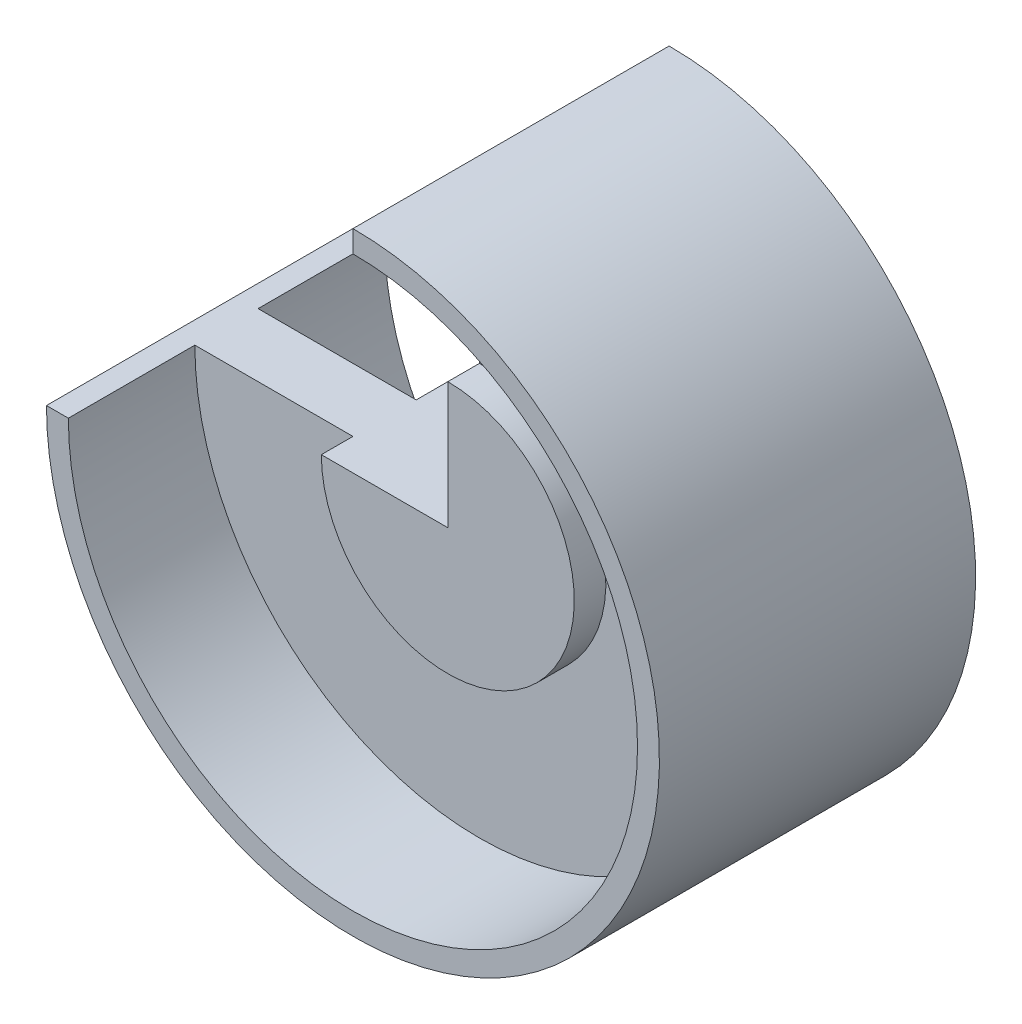
ISO-10303-21;
HEADER;
FILE_DESCRIPTION(('STEP AP214'),'2;1');
FILE_NAME('part.step','',(''),(''),'','','');
FILE_SCHEMA(('AUTOMOTIVE_DESIGN { 1 0 10303 214 1 1 1 1 }'));
ENDSEC;
DATA;
#1=APPLICATION_CONTEXT('core data for automotive mechanical design processes');
#2=APPLICATION_PROTOCOL_DEFINITION('international standard','automotive_design',2000,#1);
#3=PRODUCT_CONTEXT('',#1,'mechanical');
#4=PRODUCT('Part','Part','',(#3));
#5=PRODUCT_RELATED_PRODUCT_CATEGORY('part','',(#4));
#6=PRODUCT_DEFINITION_FORMATION('','',#4);
#7=PRODUCT_DEFINITION_CONTEXT('part definition',#1,'design');
#8=PRODUCT_DEFINITION('design','',#6,#7);
#9=PRODUCT_DEFINITION_SHAPE('','',#8);
#10=(LENGTH_UNIT() NAMED_UNIT(*) SI_UNIT(.MILLI.,.METRE.));
#11=(NAMED_UNIT(*) PLANE_ANGLE_UNIT() SI_UNIT($,.RADIAN.));
#12=(NAMED_UNIT(*) SI_UNIT($,.STERADIAN.) SOLID_ANGLE_UNIT());
#13=UNCERTAINTY_MEASURE_WITH_UNIT(LENGTH_MEASURE(1.E-05),#10,'distance_accuracy_value','');
#14=(GEOMETRIC_REPRESENTATION_CONTEXT(3) GLOBAL_UNCERTAINTY_ASSIGNED_CONTEXT((#13)) GLOBAL_UNIT_ASSIGNED_CONTEXT((#10,
#11,#12)) REPRESENTATION_CONTEXT('',''));
#15=CARTESIAN_POINT('',(0.,0.,0.));
#16=DIRECTION('',(0.,0.,1.));
#17=DIRECTION('',(1.,0.,0.));
#18=AXIS2_PLACEMENT_3D('',#15,#16,#17);
#19=CARTESIAN_POINT('',(0.,1.84127628904227,-40000.));
#20=DIRECTION('',(0.,0.,1.));
#21=DIRECTION('',(0.,-1.,0.));
#22=AXIS2_PLACEMENT_3D('',#19,#20,#21);
#23=PLANE('',#22);
#24=CARTESIAN_POINT('',(0.,1.84127628904227,-40000.));
#25=DIRECTION('',(0.,0.,1.));
#26=DIRECTION('',(0.,-1.,0.));
#27=AXIS2_PLACEMENT_3D('',#24,#25,#26);
#28=CIRCLE('',#27,20000.);
#29=CARTESIAN_POINT('',(-20000.,1.84127628925176,-40000.));
#30=VERTEX_POINT('',#29);
#31=CARTESIAN_POINT('',(0.,20001.841276289,-40000.));
#32=VERTEX_POINT('',#31);
#33=EDGE_CURVE('E11',#30,#32,#28,.T.);
#34=ORIENTED_EDGE('',*,*,#33,.F.);
#35=DIRECTION('',(-1.,0.,0.));
#36=VECTOR('',#35,1.);
#37=CARTESIAN_POINT('',(0.,1.84127628904227,-40000.));
#38=LINE('',#37,#36);
#39=CARTESIAN_POINT('',(0.,1.84127628904227,-40000.));
#40=VERTEX_POINT('',#39);
#41=EDGE_CURVE('E126',#40,#30,#38,.T.);
#42=ORIENTED_EDGE('',*,*,#41,.F.);
#43=DIRECTION('',(0.,1.,0.));
#44=VECTOR('',#43,1.);
#45=CARTESIAN_POINT('',(0.,1.84127628904227,-40000.));
#46=LINE('',#45,#44);
#47=EDGE_CURVE('E52',#40,#32,#46,.T.);
#48=ORIENTED_EDGE('',*,*,#47,.T.);
#49=EDGE_LOOP('',(#34,#42,#48));
#50=FACE_BOUND('',#49,.T.);
#51=ADVANCED_FACE('F37',(#50),#23,.F.);
#52=CARTESIAN_POINT('',(0.,1.84127628903982,-20000.));
#53=DIRECTION('',(0.,0.,1.));
#54=DIRECTION('',(0.,-1.,0.));
#55=AXIS2_PLACEMENT_3D('',#52,#53,#54);
#56=CYLINDRICAL_SURFACE('',#55,20000.);
#57=CARTESIAN_POINT('',(0.,1.84127628904166,-35000.));
#58=DIRECTION('',(0.,0.,1.));
#59=DIRECTION('',(0.,-1.,0.));
#60=AXIS2_PLACEMENT_3D('',#57,#58,#59);
#61=CIRCLE('',#60,20000.);
#62=CARTESIAN_POINT('',(-20000.,1.84127628925115,-35000.));
#63=VERTEX_POINT('',#62);
#64=CARTESIAN_POINT('',(0.,20001.841276289,-35000.));
#65=VERTEX_POINT('',#64);
#66=EDGE_CURVE('E45',#63,#65,#61,.T.);
#67=ORIENTED_EDGE('',*,*,#66,.F.);
#68=DIRECTION('',(0.,0.,1.));
#69=VECTOR('',#68,1.);
#70=CARTESIAN_POINT('',(-20000.,1.84127628925176,-40000.));
#71=LINE('',#70,#69);
#72=EDGE_CURVE('E123',#30,#63,#71,.T.);
#73=ORIENTED_EDGE('',*,*,#72,.F.);
#74=ORIENTED_EDGE('',*,*,#33,.T.);
#75=DIRECTION('',(0.,0.,1.));
#76=VECTOR('',#75,1.);
#77=CARTESIAN_POINT('',(0.,20001.841276289,-40000.));
#78=LINE('',#77,#76);
#79=EDGE_CURVE('E120',#32,#65,#78,.T.);
#80=ORIENTED_EDGE('',*,*,#79,.T.);
#81=EDGE_LOOP('',(#67,#73,#74,#80));
#82=FACE_BOUND('',#81,.T.);
#83=ADVANCED_FACE('F39',(#82),#56,.T.);
#84=CARTESIAN_POINT('',(-20000.,1.84127628925115,-35000.));
#85=DIRECTION('',(0.,0.,1.));
#86=DIRECTION('',(0.,-1.,0.));
#87=AXIS2_PLACEMENT_3D('',#84,#85,#86);
#88=PLANE('',#87);
#89=CARTESIAN_POINT('',(0.,1.84127628904166,-35000.));
#90=DIRECTION('',(0.,0.,1.));
#91=DIRECTION('',(0.,-1.,0.));
#92=AXIS2_PLACEMENT_3D('',#89,#90,#91);
#93=CIRCLE('',#92,45000.);
#94=CARTESIAN_POINT('',(-45000.,1.84127628951301,-35000.));
#95=VERTEX_POINT('',#94);
#96=CARTESIAN_POINT('',(0.,45001.841276289,-35000.));
#97=VERTEX_POINT('',#96);
#98=EDGE_CURVE('E202',#95,#97,#93,.T.);
#99=ORIENTED_EDGE('',*,*,#98,.F.);
#100=DIRECTION('',(-1.,0.,0.));
#101=VECTOR('',#100,1.);
#102=CARTESIAN_POINT('',(-20000.,1.84127628925115,-35000.));
#103=LINE('',#102,#101);
#104=EDGE_CURVE('E160',#63,#95,#103,.T.);
#105=ORIENTED_EDGE('',*,*,#104,.F.);
#106=ORIENTED_EDGE('',*,*,#66,.T.);
#107=DIRECTION('',(0.,1.,0.));
#108=VECTOR('',#107,1.);
#109=CARTESIAN_POINT('',(0.,20001.841276289,-35000.));
#110=LINE('',#109,#108);
#111=EDGE_CURVE('E131',#65,#97,#110,.T.);
#112=ORIENTED_EDGE('',*,*,#111,.T.);
#113=EDGE_LOOP('',(#99,#105,#106,#112));
#114=FACE_BOUND('',#113,.T.);
#115=ADVANCED_FACE('F205',(#114),#88,.F.);
#116=CARTESIAN_POINT('',(0.,1.84127628903982,-20000.));
#117=DIRECTION('',(0.,0.,1.));
#118=DIRECTION('',(0.,-1.,0.));
#119=AXIS2_PLACEMENT_3D('',#116,#117,#118);
#120=CYLINDRICAL_SURFACE('',#119,45000.);
#121=CARTESIAN_POINT('',(0.,1.84127628904411,-55000.));
#122=DIRECTION('',(0.,0.,1.));
#123=DIRECTION('',(0.,-1.,0.));
#124=AXIS2_PLACEMENT_3D('',#121,#122,#123);
#125=CIRCLE('',#124,45000.);
#126=CARTESIAN_POINT('',(-45000.,1.84127628951546,-55000.));
#127=VERTEX_POINT('',#126);
#128=CARTESIAN_POINT('',(0.,45001.8412762891,-55000.));
#129=VERTEX_POINT('',#128);
#130=EDGE_CURVE('E200',#127,#129,#125,.T.);
#131=ORIENTED_EDGE('',*,*,#130,.F.);
#132=DIRECTION('',(0.,0.,-1.));
#133=VECTOR('',#132,1.);
#134=CARTESIAN_POINT('',(-45000.,1.84127628951301,-35000.));
#135=LINE('',#134,#133);
#136=EDGE_CURVE('E163',#95,#127,#135,.T.);
#137=ORIENTED_EDGE('',*,*,#136,.F.);
#138=ORIENTED_EDGE('',*,*,#98,.T.);
#139=DIRECTION('',(0.,0.,-1.));
#140=VECTOR('',#139,1.);
#141=CARTESIAN_POINT('',(0.,45001.841276289,-35000.));
#142=LINE('',#141,#140);
#143=EDGE_CURVE('E133',#97,#129,#142,.T.);
#144=ORIENTED_EDGE('',*,*,#143,.T.);
#145=EDGE_LOOP('',(#131,#137,#138,#144));
#146=FACE_BOUND('',#145,.T.);
#147=ADVANCED_FACE('F237',(#146),#120,.F.);
#148=CARTESIAN_POINT('',(-45000.,1.84127628951546,-55000.));
#149=DIRECTION('',(0.,0.,1.));
#150=DIRECTION('',(0.,-1.,0.));
#151=AXIS2_PLACEMENT_3D('',#148,#149,#150);
#152=PLANE('',#151);
#153=CARTESIAN_POINT('',(0.,1.84127628904411,-55000.));
#154=DIRECTION('',(0.,0.,1.));
#155=DIRECTION('',(0.,-1.,0.));
#156=AXIS2_PLACEMENT_3D('',#153,#154,#155);
#157=CIRCLE('',#156,48463.8192766661);
#158=CARTESIAN_POINT('',(-48463.8192766661,1.84127628955174,-55000.));
#159=VERTEX_POINT('',#158);
#160=CARTESIAN_POINT('',(0.,48465.6605529551,-55000.));
#161=VERTEX_POINT('',#160);
#162=EDGE_CURVE('E198',#159,#161,#157,.T.);
#163=ORIENTED_EDGE('',*,*,#162,.F.);
#164=DIRECTION('',(-1.,0.,0.));
#165=VECTOR('',#164,1.);
#166=CARTESIAN_POINT('',(-45000.,1.84127628951546,-55000.));
#167=LINE('',#166,#165);
#168=EDGE_CURVE('E166',#127,#159,#167,.T.);
#169=ORIENTED_EDGE('',*,*,#168,.F.);
#170=ORIENTED_EDGE('',*,*,#130,.T.);
#171=DIRECTION('',(0.,1.,0.));
#172=VECTOR('',#171,1.);
#173=CARTESIAN_POINT('',(0.,45001.8412762891,-55000.));
#174=LINE('',#173,#172);
#175=EDGE_CURVE('E138',#129,#161,#174,.T.);
#176=ORIENTED_EDGE('',*,*,#175,.T.);
#177=EDGE_LOOP('',(#163,#169,#170,#176));
#178=FACE_BOUND('',#177,.T.);
#179=ADVANCED_FACE('F235',(#178),#152,.F.);
#180=CARTESIAN_POINT('',(0.,1.84127628903982,-20000.));
#181=DIRECTION('',(0.,0.,1.));
#182=DIRECTION('',(0.,-1.,0.));
#183=AXIS2_PLACEMENT_3D('',#180,#181,#182);
#184=CYLINDRICAL_SURFACE('',#183,48463.8192766661);
#185=CARTESIAN_POINT('',(0.,1.84127628903798,-5000.00000000001));
#186=DIRECTION('',(0.,0.,1.));
#187=DIRECTION('',(0.,-1.,0.));
#188=AXIS2_PLACEMENT_3D('',#185,#186,#187);
#189=CIRCLE('',#188,48463.8192766661);
#190=CARTESIAN_POINT('',(-48463.8192766661,1.84127628954562,-5000.00000000001));
#191=VERTEX_POINT('',#190);
#192=CARTESIAN_POINT('',(0.,48465.6605529551,-5000.));
#193=VERTEX_POINT('',#192);
#194=EDGE_CURVE('E196',#191,#193,#189,.T.);
#195=ORIENTED_EDGE('',*,*,#194,.F.);
#196=DIRECTION('',(0.,0.,1.));
#197=VECTOR('',#196,1.);
#198=CARTESIAN_POINT('',(-48463.8192766661,1.84127628955174,-55000.));
#199=LINE('',#198,#197);
#200=EDGE_CURVE('E169',#159,#191,#199,.T.);
#201=ORIENTED_EDGE('',*,*,#200,.F.);
#202=ORIENTED_EDGE('',*,*,#162,.T.);
#203=DIRECTION('',(0.,0.,1.));
#204=VECTOR('',#203,1.);
#205=CARTESIAN_POINT('',(0.,48465.6605529551,-55000.));
#206=LINE('',#205,#204);
#207=EDGE_CURVE('E141',#161,#193,#206,.T.);
#208=ORIENTED_EDGE('',*,*,#207,.T.);
#209=EDGE_LOOP('',(#195,#201,#202,#208));
#210=FACE_BOUND('',#209,.T.);
#211=ADVANCED_FACE('F232',(#210),#184,.T.);
#212=CARTESIAN_POINT('',(-45000.,1.84127628950933,-5000.00000000001));
#213=DIRECTION('',(0.,0.,-1.));
#214=DIRECTION('',(0.,1.,0.));
#215=AXIS2_PLACEMENT_3D('',#212,#213,#214);
#216=PLANE('',#215);
#217=CARTESIAN_POINT('',(0.,1.84127628903798,-5000.00000000001));
#218=DIRECTION('',(0.,0.,1.));
#219=DIRECTION('',(0.,-1.,0.));
#220=AXIS2_PLACEMENT_3D('',#217,#218,#219);
#221=CIRCLE('',#220,45000.);
#222=CARTESIAN_POINT('',(-45000.,1.84127628950933,-5000.00000000001));
#223=VERTEX_POINT('',#222);
#224=CARTESIAN_POINT('',(0.,45001.841276289,-5000.));
#225=VERTEX_POINT('',#224);
#226=EDGE_CURVE('E194',#223,#225,#221,.T.);
#227=ORIENTED_EDGE('',*,*,#226,.F.);
#228=DIRECTION('',(1.,0.,0.));
#229=VECTOR('',#228,1.);
#230=CARTESIAN_POINT('',(-45000.,1.84127628950933,-5000.00000000001));
#231=LINE('',#230,#229);
#232=EDGE_CURVE('E172',#191,#223,#231,.T.);
#233=ORIENTED_EDGE('',*,*,#232,.F.);
#234=ORIENTED_EDGE('',*,*,#194,.T.);
#235=DIRECTION('',(0.,-1.,0.));
#236=VECTOR('',#235,1.);
#237=CARTESIAN_POINT('',(0.,45001.841276289,-5000.));
#238=LINE('',#237,#236);
#239=EDGE_CURVE('E144',#193,#225,#238,.T.);
#240=ORIENTED_EDGE('',*,*,#239,.T.);
#241=EDGE_LOOP('',(#227,#233,#234,#240));
#242=FACE_BOUND('',#241,.T.);
#243=ADVANCED_FACE('F228',(#242),#216,.F.);
#244=CARTESIAN_POINT('',(0.,1.84127628903982,-20000.));
#245=DIRECTION('',(0.,0.,1.));
#246=DIRECTION('',(0.,-1.,0.));
#247=AXIS2_PLACEMENT_3D('',#244,#245,#246);
#248=CYLINDRICAL_SURFACE('',#247,45000.);
#249=CARTESIAN_POINT('',(0.,1.84127628904043,-25000.));
#250=DIRECTION('',(0.,0.,1.));
#251=DIRECTION('',(0.,-1.,0.));
#252=AXIS2_PLACEMENT_3D('',#249,#250,#251);
#253=CIRCLE('',#252,45000.);
#254=CARTESIAN_POINT('',(-45000.,1.84127628951178,-25000.));
#255=VERTEX_POINT('',#254);
#256=CARTESIAN_POINT('',(0.,45001.841276289,-25000.));
#257=VERTEX_POINT('',#256);
#258=EDGE_CURVE('E192',#255,#257,#253,.T.);
#259=ORIENTED_EDGE('',*,*,#258,.F.);
#260=DIRECTION('',(0.,0.,-1.));
#261=VECTOR('',#260,1.);
#262=CARTESIAN_POINT('',(-45000.,1.84127628951178,-25000.));
#263=LINE('',#262,#261);
#264=EDGE_CURVE('E175',#223,#255,#263,.T.);
#265=ORIENTED_EDGE('',*,*,#264,.F.);
#266=ORIENTED_EDGE('',*,*,#226,.T.);
#267=DIRECTION('',(0.,0.,-1.));
#268=VECTOR('',#267,1.);
#269=CARTESIAN_POINT('',(0.,45001.841276289,-25000.));
#270=LINE('',#269,#268);
#271=EDGE_CURVE('E147',#225,#257,#270,.T.);
#272=ORIENTED_EDGE('',*,*,#271,.T.);
#273=EDGE_LOOP('',(#259,#265,#266,#272));
#274=FACE_BOUND('',#273,.T.);
#275=ADVANCED_FACE('F223',(#274),#248,.F.);
#276=CARTESIAN_POINT('',(-20000.,1.84127628924992,-25000.));
#277=DIRECTION('',(0.,0.,-1.));
#278=DIRECTION('',(0.,1.,0.));
#279=AXIS2_PLACEMENT_3D('',#276,#277,#278);
#280=PLANE('',#279);
#281=CARTESIAN_POINT('',(0.,1.84127628904043,-25000.));
#282=DIRECTION('',(0.,0.,1.));
#283=DIRECTION('',(0.,-1.,0.));
#284=AXIS2_PLACEMENT_3D('',#281,#282,#283);
#285=CIRCLE('',#284,20000.);
#286=CARTESIAN_POINT('',(-20000.,1.84127628924992,-25000.));
#287=VERTEX_POINT('',#286);
#288=CARTESIAN_POINT('',(0.,20001.841276289,-25000.));
#289=VERTEX_POINT('',#288);
#290=EDGE_CURVE('E190',#287,#289,#285,.T.);
#291=ORIENTED_EDGE('',*,*,#290,.F.);
#292=DIRECTION('',(1.,0.,0.));
#293=VECTOR('',#292,1.);
#294=CARTESIAN_POINT('',(-20000.,1.84127628924992,-25000.));
#295=LINE('',#294,#293);
#296=EDGE_CURVE('E178',#255,#287,#295,.T.);
#297=ORIENTED_EDGE('',*,*,#296,.F.);
#298=ORIENTED_EDGE('',*,*,#258,.T.);
#299=DIRECTION('',(0.,-1.,0.));
#300=VECTOR('',#299,1.);
#301=CARTESIAN_POINT('',(0.,20001.841276289,-25000.));
#302=LINE('',#301,#300);
#303=EDGE_CURVE('E150',#257,#289,#302,.T.);
#304=ORIENTED_EDGE('',*,*,#303,.T.);
#305=EDGE_LOOP('',(#291,#297,#298,#304));
#306=FACE_BOUND('',#305,.T.);
#307=ADVANCED_FACE('F220',(#306),#280,.F.);
#308=CARTESIAN_POINT('',(0.,1.84127628903982,-20000.));
#309=DIRECTION('',(0.,0.,1.));
#310=DIRECTION('',(0.,-1.,0.));
#311=AXIS2_PLACEMENT_3D('',#308,#309,#310);
#312=CYLINDRICAL_SURFACE('',#311,20000.);
#313=CARTESIAN_POINT('',(0.,1.84127628903982,-20000.));
#314=DIRECTION('',(0.,0.,1.));
#315=DIRECTION('',(0.,-1.,0.));
#316=AXIS2_PLACEMENT_3D('',#313,#314,#315);
#317=CIRCLE('',#316,20000.);
#318=CARTESIAN_POINT('',(-20000.,1.84127628924931,-20000.));
#319=VERTEX_POINT('',#318);
#320=CARTESIAN_POINT('',(0.,20001.841276289,-20000.));
#321=VERTEX_POINT('',#320);
#322=EDGE_CURVE('E188',#319,#321,#317,.T.);
#323=ORIENTED_EDGE('',*,*,#322,.F.);
#324=DIRECTION('',(0.,0.,1.));
#325=VECTOR('',#324,1.);
#326=CARTESIAN_POINT('',(-20000.,1.84127628924931,-20000.));
#327=LINE('',#326,#325);
#328=EDGE_CURVE('E181',#287,#319,#327,.T.);
#329=ORIENTED_EDGE('',*,*,#328,.F.);
#330=ORIENTED_EDGE('',*,*,#290,.T.);
#331=DIRECTION('',(0.,0.,1.));
#332=VECTOR('',#331,1.);
#333=CARTESIAN_POINT('',(0.,20001.841276289,-20000.));
#334=LINE('',#333,#332);
#335=EDGE_CURVE('E153',#289,#321,#334,.T.);
#336=ORIENTED_EDGE('',*,*,#335,.T.);
#337=EDGE_LOOP('',(#323,#329,#330,#336));
#338=FACE_BOUND('',#337,.T.);
#339=ADVANCED_FACE('F217',(#338),#312,.T.);
#340=CARTESIAN_POINT('',(0.,1.84127628903982,-20000.));
#341=DIRECTION('',(0.,0.,-1.));
#342=DIRECTION('',(0.,1.,0.));
#343=AXIS2_PLACEMENT_3D('',#340,#341,#342);
#344=PLANE('',#343);
#345=DIRECTION('',(0.,-1.,0.));
#346=VECTOR('',#345,1.);
#347=CARTESIAN_POINT('',(0.,1.84127628903982,-20000.));
#348=LINE('',#347,#346);
#349=CARTESIAN_POINT('',(0.,1.84127628903982,-20000.));
#350=VERTEX_POINT('',#349);
#351=EDGE_CURVE('E156',#321,#350,#348,.T.);
#352=ORIENTED_EDGE('',*,*,#351,.T.);
#353=DIRECTION('',(1.,0.,0.));
#354=VECTOR('',#353,1.);
#355=CARTESIAN_POINT('',(0.,1.84127628903982,-20000.));
#356=LINE('',#355,#354);
#357=EDGE_CURVE('E184',#319,#350,#356,.T.);
#358=ORIENTED_EDGE('',*,*,#357,.F.);
#359=ORIENTED_EDGE('',*,*,#322,.T.);
#360=EDGE_LOOP('',(#352,#358,#359));
#361=FACE_BOUND('',#360,.T.);
#362=ADVANCED_FACE('F212',(#361),#344,.F.);
#363=CARTESIAN_POINT('',(1.84127628903737,1.84127628903735,0.));
#364=DIRECTION('',(0.,1.,0.));
#365=DIRECTION('',(0.,0.,-1.));
#366=AXIS2_PLACEMENT_3D('',#363,#364,#365);
#367=PLANE('',#366);
#368=ORIENTED_EDGE('',*,*,#41,.T.);
#369=ORIENTED_EDGE('',*,*,#72,.T.);
#370=ORIENTED_EDGE('',*,*,#104,.T.);
#371=ORIENTED_EDGE('',*,*,#136,.T.);
#372=ORIENTED_EDGE('',*,*,#168,.T.);
#373=ORIENTED_EDGE('',*,*,#200,.T.);
#374=ORIENTED_EDGE('',*,*,#232,.T.);
#375=ORIENTED_EDGE('',*,*,#264,.T.);
#376=ORIENTED_EDGE('',*,*,#296,.T.);
#377=ORIENTED_EDGE('',*,*,#328,.T.);
#378=ORIENTED_EDGE('',*,*,#357,.T.);
#379=DIRECTION('',(0.,0.,-1.));
#380=VECTOR('',#379,1.);
#381=CARTESIAN_POINT('',(0.,1.84127628903982,-20000.));
#382=LINE('',#381,#380);
#383=EDGE_CURVE('E57',#350,#40,#382,.T.);
#384=ORIENTED_EDGE('',*,*,#383,.T.);
#385=EDGE_LOOP('',(#368,#369,#370,#371,#372,#373,#374,#375,#376,#377,#378,#384));
#386=FACE_BOUND('',#385,.T.);
#387=ADVANCED_FACE('F207',(#386),#367,.T.);
#388=CARTESIAN_POINT('',(0.,0.,0.));
#389=DIRECTION('',(1.,0.,0.));
#390=DIRECTION('',(0.,0.,-1.));
#391=AXIS2_PLACEMENT_3D('',#388,#389,#390);
#392=PLANE('',#391);
#393=ORIENTED_EDGE('',*,*,#47,.F.);
#394=ORIENTED_EDGE('',*,*,#383,.F.);
#395=ORIENTED_EDGE('',*,*,#351,.F.);
#396=ORIENTED_EDGE('',*,*,#335,.F.);
#397=ORIENTED_EDGE('',*,*,#303,.F.);
#398=ORIENTED_EDGE('',*,*,#271,.F.);
#399=ORIENTED_EDGE('',*,*,#239,.F.);
#400=ORIENTED_EDGE('',*,*,#207,.F.);
#401=ORIENTED_EDGE('',*,*,#175,.F.);
#402=ORIENTED_EDGE('',*,*,#143,.F.);
#403=ORIENTED_EDGE('',*,*,#111,.F.);
#404=ORIENTED_EDGE('',*,*,#79,.F.);
#405=EDGE_LOOP('',(#393,#394,#395,#396,#397,#398,#399,#400,#401,#402,#403,#404));
#406=FACE_BOUND('',#405,.T.);
#407=ADVANCED_FACE('F128',(#406),#392,.F.);
#408=CLOSED_SHELL('',(#51,#83,#115,#147,#179,#211,#243,#275,#307,#339,#362,#387,#407));
#409=MANIFOLD_SOLID_BREP('B2',#408);
#410=ADVANCED_BREP_SHAPE_REPRESENTATION('',(#18,#409),#14);
#411=SHAPE_DEFINITION_REPRESENTATION(#9,#410);
ENDSEC;
END-ISO-10303-21;
